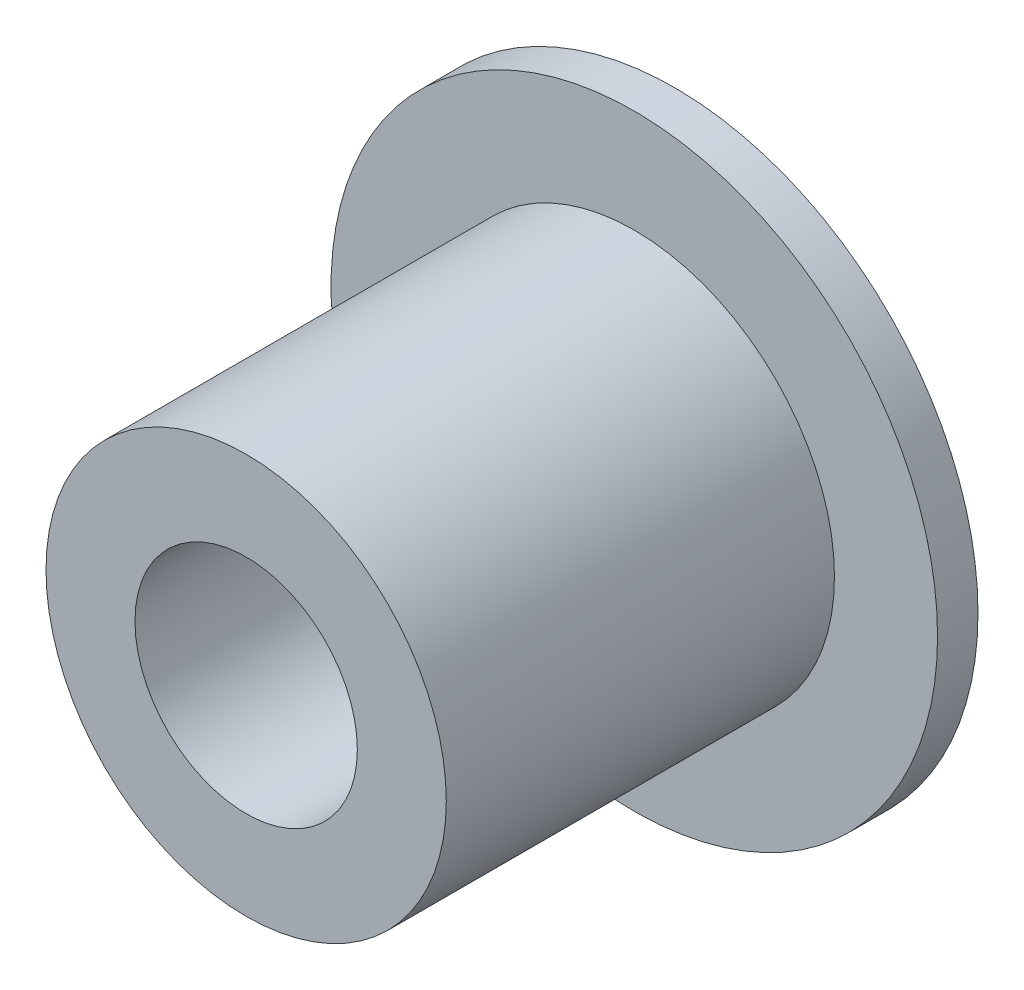
ISO-10303-21;
HEADER;
FILE_DESCRIPTION(('STEP AP214'),'2;1');
FILE_NAME('part.step','',(''),(''),'','','');
FILE_SCHEMA(('AUTOMOTIVE_DESIGN { 1 0 10303 214 1 1 1 1 }'));
ENDSEC;
DATA;
#1=APPLICATION_CONTEXT('core data for automotive mechanical design processes');
#2=APPLICATION_PROTOCOL_DEFINITION('international standard','automotive_design',2000,#1);
#3=PRODUCT_CONTEXT('',#1,'mechanical');
#4=PRODUCT('Part','Part','',(#3));
#5=PRODUCT_RELATED_PRODUCT_CATEGORY('part','',(#4));
#6=PRODUCT_DEFINITION_FORMATION('','',#4);
#7=PRODUCT_DEFINITION_CONTEXT('part definition',#1,'design');
#8=PRODUCT_DEFINITION('design','',#6,#7);
#9=PRODUCT_DEFINITION_SHAPE('','',#8);
#10=(LENGTH_UNIT() NAMED_UNIT(*) SI_UNIT(.MILLI.,.METRE.));
#11=(NAMED_UNIT(*) PLANE_ANGLE_UNIT() SI_UNIT($,.RADIAN.));
#12=(NAMED_UNIT(*) SI_UNIT($,.STERADIAN.) SOLID_ANGLE_UNIT());
#13=UNCERTAINTY_MEASURE_WITH_UNIT(LENGTH_MEASURE(1.E-05),#10,'distance_accuracy_value','');
#14=(GEOMETRIC_REPRESENTATION_CONTEXT(3) GLOBAL_UNCERTAINTY_ASSIGNED_CONTEXT((#13)) GLOBAL_UNIT_ASSIGNED_CONTEXT((#10,
#11,#12)) REPRESENTATION_CONTEXT('',''));
#15=CARTESIAN_POINT('',(0.,0.,0.));
#16=DIRECTION('',(0.,0.,1.));
#17=DIRECTION('',(1.,0.,0.));
#18=AXIS2_PLACEMENT_3D('',#15,#16,#17);
#19=CARTESIAN_POINT('',(181.,-2.50000000000001,45.));
#20=DIRECTION('',(0.,0.,1.));
#21=DIRECTION('',(1.,0.,0.));
#22=AXIS2_PLACEMENT_3D('',#19,#20,#21);
#23=CYLINDRICAL_SURFACE('',#22,2.75);
#24=CARTESIAN_POINT('',(181.,-2.50000000000001,34.));
#25=DIRECTION('',(0.,0.,1.));
#26=DIRECTION('',(1.,0.,0.));
#27=AXIS2_PLACEMENT_3D('',#24,#25,#26);
#28=CIRCLE('',#27,2.75);
#29=CARTESIAN_POINT('',(183.75,-2.50000000000001,34.));
#30=VERTEX_POINT('',#29);
#31=EDGE_CURVE('E53',#30,#30,#28,.T.);
#32=ORIENTED_EDGE('',*,*,#31,.F.);
#33=EDGE_LOOP('',(#32));
#34=FACE_BOUND('',#33,.T.);
#35=CARTESIAN_POINT('',(181.,-2.50000000000001,44.6));
#36=DIRECTION('',(0.,0.,1.));
#37=DIRECTION('',(1.,0.,0.));
#38=AXIS2_PLACEMENT_3D('',#35,#36,#37);
#39=CIRCLE('',#38,2.75);
#40=CARTESIAN_POINT('',(183.75,-2.50000000000001,44.6));
#41=VERTEX_POINT('',#40);
#42=EDGE_CURVE('E10',#41,#41,#39,.T.);
#43=ORIENTED_EDGE('',*,*,#42,.T.);
#44=EDGE_LOOP('',(#43));
#45=FACE_BOUND('',#44,.T.);
#46=ADVANCED_FACE('F31',(#34,#45),#23,.F.);
#47=CARTESIAN_POINT('',(178.25,-2.50000000000001,44.6));
#48=DIRECTION('',(0.,0.,-1.));
#49=DIRECTION('',(-1.,0.,0.));
#50=AXIS2_PLACEMENT_3D('',#47,#48,#49);
#51=PLANE('',#50);
#52=ORIENTED_EDGE('',*,*,#42,.F.);
#53=EDGE_LOOP('',(#52));
#54=FACE_BOUND('',#53,.T.);
#55=CARTESIAN_POINT('',(181.,-2.50000000000001,44.6));
#56=DIRECTION('',(0.,0.,1.));
#57=DIRECTION('',(1.,0.,0.));
#58=AXIS2_PLACEMENT_3D('',#55,#56,#57);
#59=CIRCLE('',#58,4.95000000000001);
#60=CARTESIAN_POINT('',(185.95,-2.50000000000001,44.6));
#61=VERTEX_POINT('',#60);
#62=EDGE_CURVE('E37',#61,#61,#59,.T.);
#63=ORIENTED_EDGE('',*,*,#62,.T.);
#64=EDGE_LOOP('',(#63));
#65=FACE_BOUND('',#64,.T.);
#66=ADVANCED_FACE('F60',(#54,#65),#51,.F.);
#67=CARTESIAN_POINT('',(181.,-2.50000000000001,45.));
#68=DIRECTION('',(0.,0.,1.));
#69=DIRECTION('',(1.,0.,0.));
#70=AXIS2_PLACEMENT_3D('',#67,#68,#69);
#71=CYLINDRICAL_SURFACE('',#70,4.95000000000001);
#72=ORIENTED_EDGE('',*,*,#62,.F.);
#73=EDGE_LOOP('',(#72));
#74=FACE_BOUND('',#73,.T.);
#75=CARTESIAN_POINT('',(181.,-2.50000000000001,35.));
#76=DIRECTION('',(0.,0.,1.));
#77=DIRECTION('',(1.,0.,0.));
#78=AXIS2_PLACEMENT_3D('',#75,#76,#77);
#79=CIRCLE('',#78,4.95000000000001);
#80=CARTESIAN_POINT('',(185.95,-2.50000000000001,35.));
#81=VERTEX_POINT('',#80);
#82=EDGE_CURVE('E41',#81,#81,#79,.T.);
#83=ORIENTED_EDGE('',*,*,#82,.T.);
#84=EDGE_LOOP('',(#83));
#85=FACE_BOUND('',#84,.T.);
#86=ADVANCED_FACE('F64',(#74,#85),#71,.T.);
#87=CARTESIAN_POINT('',(176.05,-2.50000000000001,35.));
#88=DIRECTION('',(0.,0.,-1.));
#89=DIRECTION('',(-1.,0.,0.));
#90=AXIS2_PLACEMENT_3D('',#87,#88,#89);
#91=PLANE('',#90);
#92=ORIENTED_EDGE('',*,*,#82,.F.);
#93=EDGE_LOOP('',(#92));
#94=FACE_BOUND('',#93,.T.);
#95=CARTESIAN_POINT('',(181.,-2.50000000000001,35.));
#96=DIRECTION('',(0.,0.,1.));
#97=DIRECTION('',(1.,0.,0.));
#98=AXIS2_PLACEMENT_3D('',#95,#96,#97);
#99=CIRCLE('',#98,7.50000000000001);
#100=CARTESIAN_POINT('',(188.5,-2.50000000000001,35.));
#101=VERTEX_POINT('',#100);
#102=EDGE_CURVE('E45',#101,#101,#99,.T.);
#103=ORIENTED_EDGE('',*,*,#102,.T.);
#104=EDGE_LOOP('',(#103));
#105=FACE_BOUND('',#104,.T.);
#106=ADVANCED_FACE('F69',(#94,#105),#91,.F.);
#107=CARTESIAN_POINT('',(181.,-2.50000000000001,45.));
#108=DIRECTION('',(0.,0.,1.));
#109=DIRECTION('',(1.,0.,0.));
#110=AXIS2_PLACEMENT_3D('',#107,#108,#109);
#111=CYLINDRICAL_SURFACE('',#110,7.50000000000001);
#112=ORIENTED_EDGE('',*,*,#102,.F.);
#113=EDGE_LOOP('',(#112));
#114=FACE_BOUND('',#113,.T.);
#115=CARTESIAN_POINT('',(181.,-2.50000000000001,34.));
#116=DIRECTION('',(0.,0.,1.));
#117=DIRECTION('',(1.,0.,0.));
#118=AXIS2_PLACEMENT_3D('',#115,#116,#117);
#119=CIRCLE('',#118,7.50000000000001);
#120=CARTESIAN_POINT('',(188.5,-2.50000000000001,34.));
#121=VERTEX_POINT('',#120);
#122=EDGE_CURVE('E50',#121,#121,#119,.T.);
#123=ORIENTED_EDGE('',*,*,#122,.T.);
#124=EDGE_LOOP('',(#123));
#125=FACE_BOUND('',#124,.T.);
#126=ADVANCED_FACE('F75',(#114,#125),#111,.T.);
#127=CARTESIAN_POINT('',(173.5,-2.50000000000001,34.));
#128=DIRECTION('',(0.,0.,1.));
#129=DIRECTION('',(1.,0.,0.));
#130=AXIS2_PLACEMENT_3D('',#127,#128,#129);
#131=PLANE('',#130);
#132=ORIENTED_EDGE('',*,*,#122,.F.);
#133=EDGE_LOOP('',(#132));
#134=FACE_BOUND('',#133,.T.);
#135=ORIENTED_EDGE('',*,*,#31,.T.);
#136=EDGE_LOOP('',(#135));
#137=FACE_BOUND('',#136,.T.);
#138=ADVANCED_FACE('F57',(#134,#137),#131,.F.);
#139=CLOSED_SHELL('',(#46,#66,#86,#106,#126,#138));
#140=MANIFOLD_SOLID_BREP('B2',#139);
#141=ADVANCED_BREP_SHAPE_REPRESENTATION('',(#18,#140),#14);
#142=SHAPE_DEFINITION_REPRESENTATION(#9,#141);
ENDSEC;
END-ISO-10303-21;
